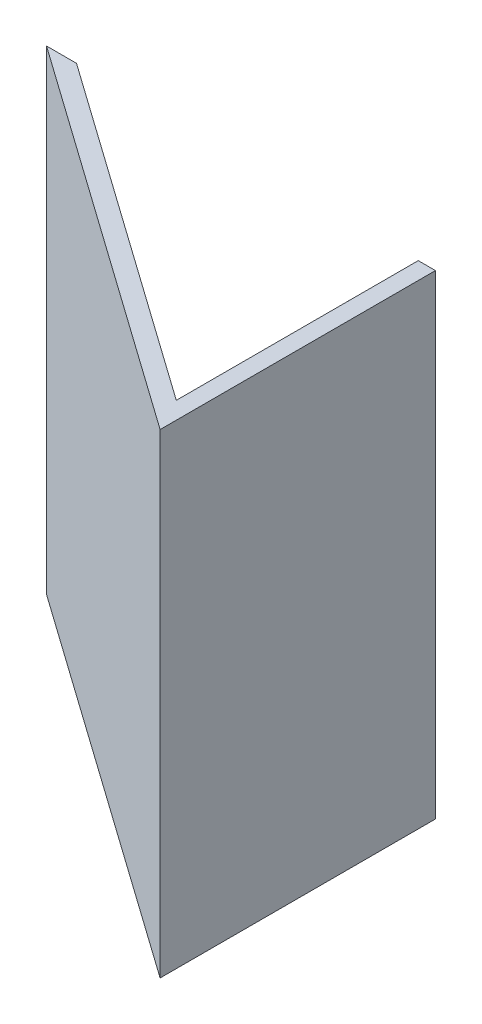
ISO-10303-21;
HEADER;
FILE_DESCRIPTION(('STEP AP214'),'2;1');
FILE_NAME('part.step','',(''),(''),'','','');
FILE_SCHEMA(('AUTOMOTIVE_DESIGN { 1 0 10303 214 1 1 1 1 }'));
ENDSEC;
DATA;
#1=APPLICATION_CONTEXT('core data for automotive mechanical design processes');
#2=APPLICATION_PROTOCOL_DEFINITION('international standard','automotive_design',2000,#1);
#3=PRODUCT_CONTEXT('',#1,'mechanical');
#4=PRODUCT('Part','Part','',(#3));
#5=PRODUCT_RELATED_PRODUCT_CATEGORY('part','',(#4));
#6=PRODUCT_DEFINITION_FORMATION('','',#4);
#7=PRODUCT_DEFINITION_CONTEXT('part definition',#1,'design');
#8=PRODUCT_DEFINITION('design','',#6,#7);
#9=PRODUCT_DEFINITION_SHAPE('','',#8);
#10=(LENGTH_UNIT() NAMED_UNIT(*) SI_UNIT(.MILLI.,.METRE.));
#11=(NAMED_UNIT(*) PLANE_ANGLE_UNIT() SI_UNIT($,.RADIAN.));
#12=(NAMED_UNIT(*) SI_UNIT($,.STERADIAN.) SOLID_ANGLE_UNIT());
#13=UNCERTAINTY_MEASURE_WITH_UNIT(LENGTH_MEASURE(1.E-05),#10,'distance_accuracy_value','');
#14=(GEOMETRIC_REPRESENTATION_CONTEXT(3) GLOBAL_UNCERTAINTY_ASSIGNED_CONTEXT((#13)) GLOBAL_UNIT_ASSIGNED_CONTEXT((#10,
#11,#12)) REPRESENTATION_CONTEXT('',''));
#15=CARTESIAN_POINT('',(0.,0.,0.));
#16=DIRECTION('',(0.,0.,1.));
#17=DIRECTION('',(1.,0.,0.));
#18=AXIS2_PLACEMENT_3D('',#15,#16,#17);
#19=CARTESIAN_POINT('',(-6.72788323187605,87.63,-34.1908451260969));
#20=DIRECTION('',(0.,0.,1.));
#21=DIRECTION('',(1.,0.,0.));
#22=AXIS2_PLACEMENT_3D('',#19,#20,#21);
#23=PLANE('',#22);
#24=DIRECTION('',(-1.,0.,0.));
#25=VECTOR('',#24,1.);
#26=CARTESIAN_POINT('',(-6.72788323187605,0.,-34.1908451260969));
#27=LINE('',#26,#25);
#28=CARTESIAN_POINT('',(-1.20084323187605,0.,-34.1908451260969));
#29=VERTEX_POINT('',#28);
#30=CARTESIAN_POINT('',(-6.72788323187605,0.,-34.1908451260969));
#31=VERTEX_POINT('',#30);
#32=EDGE_CURVE('E117',#29,#31,#27,.T.);
#33=ORIENTED_EDGE('',*,*,#32,.T.);
#34=DIRECTION('',(0.,-1.,0.));
#35=VECTOR('',#34,1.);
#36=CARTESIAN_POINT('',(-6.72788323187605,87.63,-34.1908451260969));
#37=LINE('',#36,#35);
#38=CARTESIAN_POINT('',(-6.72788323187605,87.63,-34.1908451260969));
#39=VERTEX_POINT('',#38);
#40=EDGE_CURVE('E11',#39,#31,#37,.T.);
#41=ORIENTED_EDGE('',*,*,#40,.F.);
#42=DIRECTION('',(-1.,0.,0.));
#43=VECTOR('',#42,1.);
#44=CARTESIAN_POINT('',(-6.72788323187605,87.63,-34.1908451260969));
#45=LINE('',#44,#43);
#46=CARTESIAN_POINT('',(-1.20084323187605,87.63,-34.1908451260969));
#47=VERTEX_POINT('',#46);
#48=EDGE_CURVE('E127',#47,#39,#45,.T.);
#49=ORIENTED_EDGE('',*,*,#48,.F.);
#50=DIRECTION('',(0.,-1.,0.));
#51=VECTOR('',#50,1.);
#52=CARTESIAN_POINT('',(-1.20084323187605,87.63,-34.1908451260969));
#53=LINE('',#52,#51);
#54=EDGE_CURVE('E113',#47,#29,#53,.T.);
#55=ORIENTED_EDGE('',*,*,#54,.T.);
#56=EDGE_LOOP('',(#33,#41,#49,#55));
#57=FACE_BOUND('',#56,.T.);
#58=ADVANCED_FACE('F33',(#57),#23,.F.);
#59=CARTESIAN_POINT('',(-6.72788323187605,87.63,-34.1908451260969));
#60=DIRECTION('',(0.577816924417098,0.,-0.816166405739152));
#61=DIRECTION('',(-0.816166405739152,0.,-0.577816924417098));
#62=AXIS2_PLACEMENT_3D('',#59,#60,#61);
#63=PLANE('',#62);
#64=DIRECTION('',(0.816166405739151,0.,0.577816924417098));
#65=VECTOR('',#64,1.);
#66=CARTESIAN_POINT('',(-6.72788323187605,0.,-34.1908451260969));
#67=LINE('',#66,#65);
#68=CARTESIAN_POINT('',(65.0271167681239,0.,16.6091548739031));
#69=VERTEX_POINT('',#68);
#70=EDGE_CURVE('E120',#31,#69,#67,.T.);
#71=ORIENTED_EDGE('',*,*,#70,.T.);
#72=DIRECTION('',(0.,-1.,0.));
#73=VECTOR('',#72,1.);
#74=CARTESIAN_POINT('',(65.0271167681239,87.63,16.6091548739031));
#75=LINE('',#74,#73);
#76=CARTESIAN_POINT('',(65.0271167681239,87.63,16.6091548739031));
#77=VERTEX_POINT('',#76);
#78=EDGE_CURVE('E41',#77,#69,#75,.T.);
#79=ORIENTED_EDGE('',*,*,#78,.F.);
#80=DIRECTION('',(0.816166405739151,0.,0.577816924417098));
#81=VECTOR('',#80,1.);
#82=CARTESIAN_POINT('',(-6.72788323187605,87.63,-34.1908451260969));
#83=LINE('',#82,#81);
#84=EDGE_CURVE('E86',#39,#77,#83,.T.);
#85=ORIENTED_EDGE('',*,*,#84,.F.);
#86=ORIENTED_EDGE('',*,*,#40,.T.);
#87=EDGE_LOOP('',(#71,#79,#85,#86));
#88=FACE_BOUND('',#87,.T.);
#89=ADVANCED_FACE('F151',(#88),#63,.F.);
#90=CARTESIAN_POINT('',(65.0271167681239,87.63,-34.1908451260969));
#91=DIRECTION('',(-1.,0.,0.));
#92=DIRECTION('',(0.,0.,1.));
#93=AXIS2_PLACEMENT_3D('',#90,#91,#92);
#94=PLANE('',#93);
#95=DIRECTION('',(0.,0.,-1.));
#96=VECTOR('',#95,1.);
#97=CARTESIAN_POINT('',(65.0271167681239,0.,-34.1908451260969));
#98=LINE('',#97,#96);
#99=CARTESIAN_POINT('',(65.0271167681239,0.,-34.1908451260969));
#100=VERTEX_POINT('',#99);
#101=EDGE_CURVE('E122',#69,#100,#98,.T.);
#102=ORIENTED_EDGE('',*,*,#101,.T.);
#103=DIRECTION('',(0.,-1.,0.));
#104=VECTOR('',#103,1.);
#105=CARTESIAN_POINT('',(65.0271167681239,87.63,-34.1908451260969));
#106=LINE('',#105,#104);
#107=CARTESIAN_POINT('',(65.0271167681239,87.63,-34.1908451260969));
#108=VERTEX_POINT('',#107);
#109=EDGE_CURVE('E108',#108,#100,#106,.T.);
#110=ORIENTED_EDGE('',*,*,#109,.F.);
#111=DIRECTION('',(0.,0.,-1.));
#112=VECTOR('',#111,1.);
#113=CARTESIAN_POINT('',(65.0271167681239,87.63,-34.1908451260969));
#114=LINE('',#113,#112);
#115=EDGE_CURVE('E99',#77,#108,#114,.T.);
#116=ORIENTED_EDGE('',*,*,#115,.F.);
#117=ORIENTED_EDGE('',*,*,#78,.T.);
#118=EDGE_LOOP('',(#102,#110,#116,#117));
#119=FACE_BOUND('',#118,.T.);
#120=ADVANCED_FACE('F133',(#119),#94,.F.);
#121=CARTESIAN_POINT('',(65.0271167681239,87.63,-34.1908451260969));
#122=DIRECTION('',(0.,0.,1.));
#123=DIRECTION('',(1.,0.,0.));
#124=AXIS2_PLACEMENT_3D('',#121,#122,#123);
#125=PLANE('',#124);
#126=DIRECTION('',(-1.,0.,0.));
#127=VECTOR('',#126,1.);
#128=CARTESIAN_POINT('',(65.0271167681239,0.,-34.1908451260969));
#129=LINE('',#128,#127);
#130=CARTESIAN_POINT('',(61.8521167681239,0.,-34.1908451260969));
#131=VERTEX_POINT('',#130);
#132=EDGE_CURVE('E107',#100,#131,#129,.T.);
#133=ORIENTED_EDGE('',*,*,#132,.T.);
#134=DIRECTION('',(0.,-1.,0.));
#135=VECTOR('',#134,1.);
#136=CARTESIAN_POINT('',(61.8521167681239,87.63,-34.1908451260969));
#137=LINE('',#136,#135);
#138=CARTESIAN_POINT('',(61.8521167681239,87.63,-34.1908451260969));
#139=VERTEX_POINT('',#138);
#140=EDGE_CURVE('E104',#139,#131,#137,.T.);
#141=ORIENTED_EDGE('',*,*,#140,.F.);
#142=DIRECTION('',(-1.,0.,0.));
#143=VECTOR('',#142,1.);
#144=CARTESIAN_POINT('',(65.0271167681239,87.63,-34.1908451260969));
#145=LINE('',#144,#143);
#146=EDGE_CURVE('E93',#108,#139,#145,.T.);
#147=ORIENTED_EDGE('',*,*,#146,.F.);
#148=ORIENTED_EDGE('',*,*,#109,.T.);
#149=EDGE_LOOP('',(#133,#141,#147,#148));
#150=FACE_BOUND('',#149,.T.);
#151=ADVANCED_FACE('F105',(#150),#125,.F.);
#152=CARTESIAN_POINT('',(61.8521167681239,87.63,-34.1908451260969));
#153=DIRECTION('',(1.,0.,0.));
#154=DIRECTION('',(0.,0.,-1.));
#155=AXIS2_PLACEMENT_3D('',#152,#153,#154);
#156=PLANE('',#155);
#157=DIRECTION('',(0.,0.,1.));
#158=VECTOR('',#157,1.);
#159=CARTESIAN_POINT('',(61.8521167681239,0.,-34.1908451260969));
#160=LINE('',#159,#158);
#161=CARTESIAN_POINT('',(61.8521167681239,0.,10.4496548739031));
#162=VERTEX_POINT('',#161);
#163=EDGE_CURVE('E72',#131,#162,#160,.T.);
#164=ORIENTED_EDGE('',*,*,#163,.T.);
#165=DIRECTION('',(0.,-1.,0.));
#166=VECTOR('',#165,1.);
#167=CARTESIAN_POINT('',(61.8521167681239,87.63,10.4496548739031));
#168=LINE('',#167,#166);
#169=CARTESIAN_POINT('',(61.8521167681239,87.63,10.4496548739031));
#170=VERTEX_POINT('',#169);
#171=EDGE_CURVE('E109',#170,#162,#168,.T.);
#172=ORIENTED_EDGE('',*,*,#171,.F.);
#173=DIRECTION('',(0.,0.,1.));
#174=VECTOR('',#173,1.);
#175=CARTESIAN_POINT('',(61.8521167681239,87.63,-34.1908451260969));
#176=LINE('',#175,#174);
#177=EDGE_CURVE('E97',#139,#170,#176,.T.);
#178=ORIENTED_EDGE('',*,*,#177,.F.);
#179=ORIENTED_EDGE('',*,*,#140,.T.);
#180=EDGE_LOOP('',(#164,#172,#178,#179));
#181=FACE_BOUND('',#180,.T.);
#182=ADVANCED_FACE('F111',(#181),#156,.F.);
#183=CARTESIAN_POINT('',(-1.20084323187605,87.63,-34.1908451260969));
#184=DIRECTION('',(-0.577827584058727,0.,0.816158858985709));
#185=DIRECTION('',(0.816158858985709,0.,0.577827584058727));
#186=AXIS2_PLACEMENT_3D('',#183,#184,#185);
#187=PLANE('',#186);
#188=DIRECTION('',(-0.816158858985709,0.,-0.577827584058727));
#189=VECTOR('',#188,1.);
#190=CARTESIAN_POINT('',(-1.20084323187605,0.,-34.1908451260969));
#191=LINE('',#190,#189);
#192=EDGE_CURVE('E78',#162,#29,#191,.T.);
#193=ORIENTED_EDGE('',*,*,#192,.T.);
#194=ORIENTED_EDGE('',*,*,#54,.F.);
#195=DIRECTION('',(-0.816158858985709,0.,-0.577827584058727));
#196=VECTOR('',#195,1.);
#197=CARTESIAN_POINT('',(-1.20084323187605,87.63,-34.1908451260969));
#198=LINE('',#197,#196);
#199=EDGE_CURVE('E49',#170,#47,#198,.T.);
#200=ORIENTED_EDGE('',*,*,#199,.F.);
#201=ORIENTED_EDGE('',*,*,#171,.T.);
#202=EDGE_LOOP('',(#193,#194,#200,#201));
#203=FACE_BOUND('',#202,.T.);
#204=ADVANCED_FACE('F140',(#203),#187,.F.);
#205=CARTESIAN_POINT('',(0.,87.63,0.));
#206=DIRECTION('',(0.,-1.,0.));
#207=DIRECTION('',(0.,0.,-1.));
#208=AXIS2_PLACEMENT_3D('',#205,#206,#207);
#209=PLANE('',#208);
#210=ORIENTED_EDGE('',*,*,#48,.T.);
#211=ORIENTED_EDGE('',*,*,#84,.T.);
#212=ORIENTED_EDGE('',*,*,#115,.T.);
#213=ORIENTED_EDGE('',*,*,#146,.T.);
#214=ORIENTED_EDGE('',*,*,#177,.T.);
#215=ORIENTED_EDGE('',*,*,#199,.T.);
#216=EDGE_LOOP('',(#210,#211,#212,#213,#214,#215));
#217=FACE_BOUND('',#216,.T.);
#218=ADVANCED_FACE('F95',(#217),#209,.F.);
#219=CARTESIAN_POINT('',(0.,0.,0.));
#220=DIRECTION('',(0.,-1.,0.));
#221=DIRECTION('',(0.,0.,-1.));
#222=AXIS2_PLACEMENT_3D('',#219,#220,#221);
#223=PLANE('',#222);
#224=ORIENTED_EDGE('',*,*,#32,.F.);
#225=ORIENTED_EDGE('',*,*,#192,.F.);
#226=ORIENTED_EDGE('',*,*,#163,.F.);
#227=ORIENTED_EDGE('',*,*,#132,.F.);
#228=ORIENTED_EDGE('',*,*,#101,.F.);
#229=ORIENTED_EDGE('',*,*,#70,.F.);
#230=EDGE_LOOP('',(#224,#225,#226,#227,#228,#229));
#231=FACE_BOUND('',#230,.T.);
#232=ADVANCED_FACE('F136',(#231),#223,.T.);
#233=CLOSED_SHELL('',(#58,#89,#120,#151,#182,#204,#218,#232));
#234=MANIFOLD_SOLID_BREP('B2',#233);
#235=ADVANCED_BREP_SHAPE_REPRESENTATION('',(#18,#234),#14);
#236=SHAPE_DEFINITION_REPRESENTATION(#9,#235);
ENDSEC;
END-ISO-10303-21;
